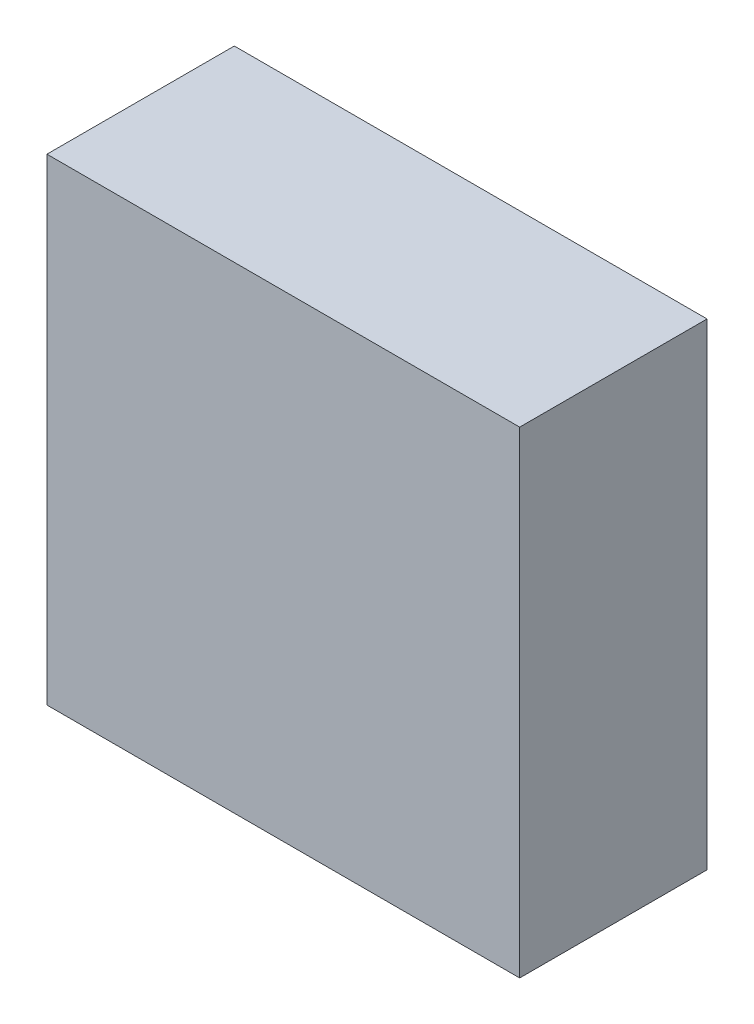
ISO-10303-21;
HEADER;
FILE_DESCRIPTION(('STEP AP214'),'2;1');
FILE_NAME('part.step','',(''),(''),'','','');
FILE_SCHEMA(('AUTOMOTIVE_DESIGN { 1 0 10303 214 1 1 1 1 }'));
ENDSEC;
DATA;
#1=APPLICATION_CONTEXT('core data for automotive mechanical design processes');
#2=APPLICATION_PROTOCOL_DEFINITION('international standard','automotive_design',2000,#1);
#3=PRODUCT_CONTEXT('',#1,'mechanical');
#4=PRODUCT('Part','Part','',(#3));
#5=PRODUCT_RELATED_PRODUCT_CATEGORY('part','',(#4));
#6=PRODUCT_DEFINITION_FORMATION('','',#4);
#7=PRODUCT_DEFINITION_CONTEXT('part definition',#1,'design');
#8=PRODUCT_DEFINITION('design','',#6,#7);
#9=PRODUCT_DEFINITION_SHAPE('','',#8);
#10=(LENGTH_UNIT() NAMED_UNIT(*) SI_UNIT(.MILLI.,.METRE.));
#11=(NAMED_UNIT(*) PLANE_ANGLE_UNIT() SI_UNIT($,.RADIAN.));
#12=(NAMED_UNIT(*) SI_UNIT($,.STERADIAN.) SOLID_ANGLE_UNIT());
#13=UNCERTAINTY_MEASURE_WITH_UNIT(LENGTH_MEASURE(1.E-05),#10,'distance_accuracy_value','');
#14=(GEOMETRIC_REPRESENTATION_CONTEXT(3) GLOBAL_UNCERTAINTY_ASSIGNED_CONTEXT((#13)) GLOBAL_UNIT_ASSIGNED_CONTEXT((#10,
#11,#12)) REPRESENTATION_CONTEXT('',''));
#15=CARTESIAN_POINT('',(0.,0.,0.));
#16=DIRECTION('',(0.,0.,1.));
#17=DIRECTION('',(1.,0.,0.));
#18=AXIS2_PLACEMENT_3D('',#15,#16,#17);
#19=CARTESIAN_POINT('',(2.7250009,2.74999958,2.16000076));
#20=DIRECTION('',(0.,0.,-1.));
#21=DIRECTION('',(-1.,0.,0.));
#22=AXIS2_PLACEMENT_3D('',#19,#20,#21);
#23=PLANE('',#22);
#24=DIRECTION('',(0.,1.,0.));
#25=VECTOR('',#24,1.);
#26=CARTESIAN_POINT('',(-2.7250009,2.74999958,2.16000076));
#27=LINE('',#26,#25);
#28=CARTESIAN_POINT('',(-2.7250009,2.74999958,2.16000076));
#29=VERTEX_POINT('',#28);
#30=CARTESIAN_POINT('',(-2.7250009,-2.74999958,2.16000076));
#31=VERTEX_POINT('',#30);
#32=EDGE_CURVE('E55',#29,#31,#27,.F.);
#33=ORIENTED_EDGE('',*,*,#32,.T.);
#34=DIRECTION('',(1.,0.,0.));
#35=VECTOR('',#34,1.);
#36=CARTESIAN_POINT('',(-2.7250009,-2.74999958,2.16000076));
#37=LINE('',#36,#35);
#38=CARTESIAN_POINT('',(2.7250009,-2.74999958,2.16000076));
#39=VERTEX_POINT('',#38);
#40=EDGE_CURVE('E57',#31,#39,#37,.T.);
#41=ORIENTED_EDGE('',*,*,#40,.T.);
#42=DIRECTION('',(0.,1.,0.));
#43=VECTOR('',#42,1.);
#44=CARTESIAN_POINT('',(2.7250009,-2.74999958,2.16000076));
#45=LINE('',#44,#43);
#46=CARTESIAN_POINT('',(2.7250009,2.74999958,2.16000076));
#47=VERTEX_POINT('',#46);
#48=EDGE_CURVE('E20',#39,#47,#45,.T.);
#49=ORIENTED_EDGE('',*,*,#48,.T.);
#50=DIRECTION('',(1.,0.,0.));
#51=VECTOR('',#50,1.);
#52=CARTESIAN_POINT('',(2.7250009,2.74999958,2.16000076));
#53=LINE('',#52,#51);
#54=EDGE_CURVE('E80',#47,#29,#53,.F.);
#55=ORIENTED_EDGE('',*,*,#54,.T.);
#56=EDGE_LOOP('',(#33,#41,#49,#55));
#57=FACE_BOUND('',#56,.T.);
#58=ADVANCED_FACE('F17',(#57),#23,.F.);
#59=CARTESIAN_POINT('',(2.7250009,-2.74999958,0.));
#60=DIRECTION('',(-1.,0.,0.));
#61=DIRECTION('',(0.,0.,1.));
#62=AXIS2_PLACEMENT_3D('',#59,#60,#61);
#63=PLANE('',#62);
#64=DIRECTION('',(0.,0.,-1.));
#65=VECTOR('',#64,1.);
#66=CARTESIAN_POINT('',(2.7250009,2.74999958,0.));
#67=LINE('',#66,#65);
#68=CARTESIAN_POINT('',(2.7250009,2.74999958,0.));
#69=VERTEX_POINT('',#68);
#70=EDGE_CURVE('E68',#69,#47,#67,.F.);
#71=ORIENTED_EDGE('',*,*,#70,.T.);
#72=ORIENTED_EDGE('',*,*,#48,.F.);
#73=DIRECTION('',(0.,0.,1.));
#74=VECTOR('',#73,1.);
#75=CARTESIAN_POINT('',(2.7250009,-2.74999958,0.));
#76=LINE('',#75,#74);
#77=CARTESIAN_POINT('',(2.7250009,-2.74999958,0.));
#78=VERTEX_POINT('',#77);
#79=EDGE_CURVE('E63',#39,#78,#76,.F.);
#80=ORIENTED_EDGE('',*,*,#79,.T.);
#81=DIRECTION('',(0.,1.,0.));
#82=VECTOR('',#81,1.);
#83=CARTESIAN_POINT('',(2.7250009,2.74999958,0.));
#84=LINE('',#83,#82);
#85=EDGE_CURVE('E83',#69,#78,#84,.F.);
#86=ORIENTED_EDGE('',*,*,#85,.F.);
#87=EDGE_LOOP('',(#71,#72,#80,#86));
#88=FACE_BOUND('',#87,.T.);
#89=ADVANCED_FACE('F65',(#88),#63,.F.);
#90=CARTESIAN_POINT('',(-2.7250009,-2.74999958,0.));
#91=DIRECTION('',(0.,1.,0.));
#92=DIRECTION('',(0.,0.,1.));
#93=AXIS2_PLACEMENT_3D('',#90,#91,#92);
#94=PLANE('',#93);
#95=ORIENTED_EDGE('',*,*,#79,.F.);
#96=ORIENTED_EDGE('',*,*,#40,.F.);
#97=DIRECTION('',(0.,0.,-1.));
#98=VECTOR('',#97,1.);
#99=CARTESIAN_POINT('',(-2.7250009,-2.74999958,0.));
#100=LINE('',#99,#98);
#101=CARTESIAN_POINT('',(-2.7250009,-2.74999958,0.));
#102=VERTEX_POINT('',#101);
#103=EDGE_CURVE('E75',#31,#102,#100,.T.);
#104=ORIENTED_EDGE('',*,*,#103,.T.);
#105=DIRECTION('',(-1.,0.,0.));
#106=VECTOR('',#105,1.);
#107=CARTESIAN_POINT('',(2.7250009,-2.74999958,0.));
#108=LINE('',#107,#106);
#109=EDGE_CURVE('E72',#78,#102,#108,.T.);
#110=ORIENTED_EDGE('',*,*,#109,.F.);
#111=EDGE_LOOP('',(#95,#96,#104,#110));
#112=FACE_BOUND('',#111,.T.);
#113=ADVANCED_FACE('F70',(#112),#94,.F.);
#114=CARTESIAN_POINT('',(-2.7250009,2.74999958,0.));
#115=DIRECTION('',(1.,0.,0.));
#116=DIRECTION('',(0.,0.,-1.));
#117=AXIS2_PLACEMENT_3D('',#114,#115,#116);
#118=PLANE('',#117);
#119=ORIENTED_EDGE('',*,*,#103,.F.);
#120=ORIENTED_EDGE('',*,*,#32,.F.);
#121=DIRECTION('',(0.,0.,-1.));
#122=VECTOR('',#121,1.);
#123=CARTESIAN_POINT('',(-2.7250009,2.74999958,0.));
#124=LINE('',#123,#122);
#125=CARTESIAN_POINT('',(-2.7250009,2.74999958,0.));
#126=VERTEX_POINT('',#125);
#127=EDGE_CURVE('E35',#29,#126,#124,.T.);
#128=ORIENTED_EDGE('',*,*,#127,.T.);
#129=DIRECTION('',(0.,1.,0.));
#130=VECTOR('',#129,1.);
#131=CARTESIAN_POINT('',(-2.7250009,2.74999958,0.));
#132=LINE('',#131,#130);
#133=EDGE_CURVE('E26',#102,#126,#132,.T.);
#134=ORIENTED_EDGE('',*,*,#133,.F.);
#135=EDGE_LOOP('',(#119,#120,#128,#134));
#136=FACE_BOUND('',#135,.T.);
#137=ADVANCED_FACE('F89',(#136),#118,.F.);
#138=CARTESIAN_POINT('',(2.7250009,2.74999958,0.));
#139=DIRECTION('',(0.,-1.,0.));
#140=DIRECTION('',(0.,0.,-1.));
#141=AXIS2_PLACEMENT_3D('',#138,#139,#140);
#142=PLANE('',#141);
#143=ORIENTED_EDGE('',*,*,#127,.F.);
#144=ORIENTED_EDGE('',*,*,#54,.F.);
#145=ORIENTED_EDGE('',*,*,#70,.F.);
#146=DIRECTION('',(-1.,0.,0.));
#147=VECTOR('',#146,1.);
#148=CARTESIAN_POINT('',(2.7250009,2.74999958,0.));
#149=LINE('',#148,#147);
#150=EDGE_CURVE('E11',#126,#69,#149,.F.);
#151=ORIENTED_EDGE('',*,*,#150,.F.);
#152=EDGE_LOOP('',(#143,#144,#145,#151));
#153=FACE_BOUND('',#152,.T.);
#154=ADVANCED_FACE('F91',(#153),#142,.F.);
#155=CARTESIAN_POINT('',(2.7250009,2.74999958,0.));
#156=DIRECTION('',(0.,0.,-1.));
#157=DIRECTION('',(-1.,0.,0.));
#158=AXIS2_PLACEMENT_3D('',#155,#156,#157);
#159=PLANE('',#158);
#160=ORIENTED_EDGE('',*,*,#133,.T.);
#161=ORIENTED_EDGE('',*,*,#150,.T.);
#162=ORIENTED_EDGE('',*,*,#85,.T.);
#163=ORIENTED_EDGE('',*,*,#109,.T.);
#164=EDGE_LOOP('',(#160,#161,#162,#163));
#165=FACE_BOUND('',#164,.T.);
#166=ADVANCED_FACE('F88',(#165),#159,.T.);
#167=CLOSED_SHELL('',(#58,#89,#113,#137,#154,#166));
#168=MANIFOLD_SOLID_BREP('B1',#167);
#169=ADVANCED_BREP_SHAPE_REPRESENTATION('',(#18,#168),#14);
#170=SHAPE_DEFINITION_REPRESENTATION(#9,#169);
ENDSEC;
END-ISO-10303-21;
